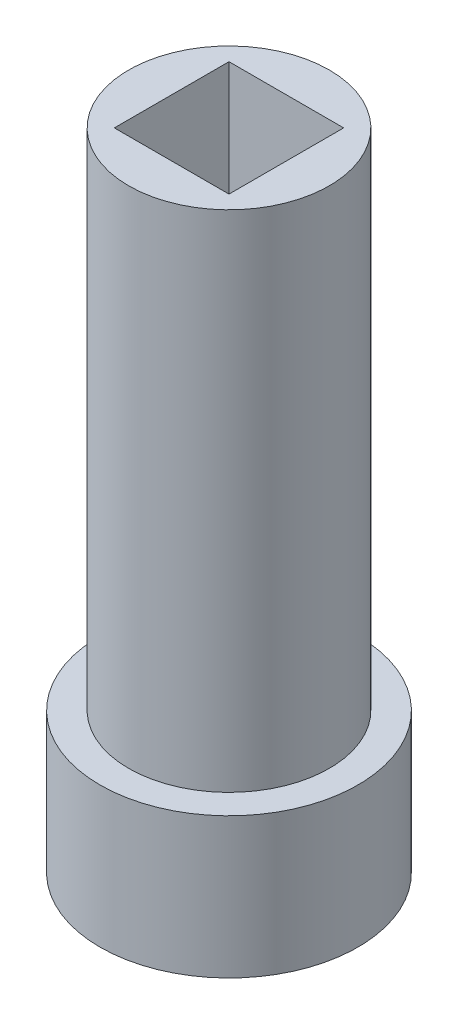
ISO-10303-21;
HEADER;
FILE_DESCRIPTION(('STEP AP214'),'2;1');
FILE_NAME('part.step','',(''),(''),'','','');
FILE_SCHEMA(('AUTOMOTIVE_DESIGN { 1 0 10303 214 1 1 1 1 }'));
ENDSEC;
DATA;
#1=APPLICATION_CONTEXT('core data for automotive mechanical design processes');
#2=APPLICATION_PROTOCOL_DEFINITION('international standard','automotive_design',2000,#1);
#3=PRODUCT_CONTEXT('',#1,'mechanical');
#4=PRODUCT('Part','Part','',(#3));
#5=PRODUCT_RELATED_PRODUCT_CATEGORY('part','',(#4));
#6=PRODUCT_DEFINITION_FORMATION('','',#4);
#7=PRODUCT_DEFINITION_CONTEXT('part definition',#1,'design');
#8=PRODUCT_DEFINITION('design','',#6,#7);
#9=PRODUCT_DEFINITION_SHAPE('','',#8);
#10=(LENGTH_UNIT() NAMED_UNIT(*) SI_UNIT(.MILLI.,.METRE.));
#11=(NAMED_UNIT(*) PLANE_ANGLE_UNIT() SI_UNIT($,.RADIAN.));
#12=(NAMED_UNIT(*) SI_UNIT($,.STERADIAN.) SOLID_ANGLE_UNIT());
#13=UNCERTAINTY_MEASURE_WITH_UNIT(LENGTH_MEASURE(1.E-05),#10,'distance_accuracy_value','');
#14=(GEOMETRIC_REPRESENTATION_CONTEXT(3) GLOBAL_UNCERTAINTY_ASSIGNED_CONTEXT((#13)) GLOBAL_UNIT_ASSIGNED_CONTEXT((#10,
#11,#12)) REPRESENTATION_CONTEXT('',''));
#15=CARTESIAN_POINT('',(0.,0.,0.));
#16=DIRECTION('',(0.,0.,1.));
#17=DIRECTION('',(1.,0.,0.));
#18=AXIS2_PLACEMENT_3D('',#15,#16,#17);
#19=CARTESIAN_POINT('',(0.,45.,0.));
#20=DIRECTION('',(0.,-1.,0.));
#21=DIRECTION('',(0.,0.,-1.));
#22=AXIS2_PLACEMENT_3D('',#19,#20,#21);
#23=CYLINDRICAL_SURFACE('',#22,7.);
#24=CARTESIAN_POINT('',(0.,45.,0.));
#25=DIRECTION('',(0.,1.,0.));
#26=DIRECTION('',(0.,0.,1.));
#27=AXIS2_PLACEMENT_3D('',#24,#25,#26);
#28=CIRCLE('',#27,7.);
#29=CARTESIAN_POINT('',(0.,45.,-7.));
#30=VERTEX_POINT('',#29);
#31=EDGE_CURVE('E44',#30,#30,#28,.T.);
#32=CARTESIAN_POINT('',(0.,9.8,0.));
#33=DIRECTION('',(0.,-1.,0.));
#34=DIRECTION('',(0.,0.,-1.));
#35=AXIS2_PLACEMENT_3D('',#32,#33,#34);
#36=CIRCLE('',#35,7.);
#37=CARTESIAN_POINT('',(0.,9.80000000000001,-7.));
#38=VERTEX_POINT('',#37);
#39=EDGE_CURVE('E11',#38,#38,#36,.T.);
#40=CARTESIAN_POINT('',(0.,45.,-7.));
#41=CARTESIAN_POINT('',(0.,44.6333333333333,-7.));
#42=CARTESIAN_POINT('',(0.,44.2666666666667,-7.));
#43=CARTESIAN_POINT('',(0.,43.5333333333333,-7.));
#44=CARTESIAN_POINT('',(0.,43.1666666666667,-7.));
#45=CARTESIAN_POINT('',(0.,42.4333333333333,-7.));
#46=CARTESIAN_POINT('',(0.,42.0666666666667,-7.));
#47=CARTESIAN_POINT('',(0.,41.3333333333333,-7.));
#48=CARTESIAN_POINT('',(0.,40.9666666666667,-7.));
#49=CARTESIAN_POINT('',(0.,40.2333333333333,-7.));
#50=CARTESIAN_POINT('',(0.,39.8666666666667,-7.));
#51=CARTESIAN_POINT('',(0.,39.1333333333333,-7.));
#52=CARTESIAN_POINT('',(0.,38.7666666666667,-7.));
#53=CARTESIAN_POINT('',(0.,38.0333333333333,-7.));
#54=CARTESIAN_POINT('',(0.,37.6666666666667,-7.));
#55=CARTESIAN_POINT('',(0.,36.9333333333333,-7.));
#56=CARTESIAN_POINT('',(0.,36.5666666666667,-7.));
#57=CARTESIAN_POINT('',(0.,35.8333333333333,-7.));
#58=CARTESIAN_POINT('',(0.,35.4666666666667,-7.));
#59=CARTESIAN_POINT('',(0.,34.7333333333333,-7.));
#60=CARTESIAN_POINT('',(0.,34.3666666666667,-7.));
#61=CARTESIAN_POINT('',(0.,33.6333333333333,-7.));
#62=CARTESIAN_POINT('',(0.,33.2666666666667,-7.));
#63=CARTESIAN_POINT('',(0.,32.5333333333333,-7.));
#64=CARTESIAN_POINT('',(0.,32.1666666666667,-7.));
#65=CARTESIAN_POINT('',(0.,31.4333333333333,-7.));
#66=CARTESIAN_POINT('',(0.,31.0666666666667,-7.));
#67=CARTESIAN_POINT('',(0.,30.3333333333333,-7.));
#68=CARTESIAN_POINT('',(0.,29.9666666666667,-7.));
#69=CARTESIAN_POINT('',(0.,29.2333333333333,-7.));
#70=CARTESIAN_POINT('',(0.,28.8666666666667,-7.));
#71=CARTESIAN_POINT('',(0.,28.1333333333333,-7.));
#72=CARTESIAN_POINT('',(0.,27.7666666666667,-7.));
#73=CARTESIAN_POINT('',(0.,27.0333333333333,-7.));
#74=CARTESIAN_POINT('',(0.,26.6666666666667,-7.));
#75=CARTESIAN_POINT('',(0.,25.9333333333333,-7.));
#76=CARTESIAN_POINT('',(0.,25.5666666666667,-7.));
#77=CARTESIAN_POINT('',(0.,24.8333333333333,-7.));
#78=CARTESIAN_POINT('',(0.,24.4666666666667,-7.));
#79=CARTESIAN_POINT('',(0.,23.7333333333333,-7.));
#80=CARTESIAN_POINT('',(0.,23.3666666666667,-7.));
#81=CARTESIAN_POINT('',(0.,22.6333333333333,-7.));
#82=CARTESIAN_POINT('',(0.,22.2666666666667,-7.));
#83=CARTESIAN_POINT('',(0.,21.5333333333333,-7.));
#84=CARTESIAN_POINT('',(0.,21.1666666666667,-7.));
#85=CARTESIAN_POINT('',(0.,20.4333333333333,-7.));
#86=CARTESIAN_POINT('',(0.,20.0666666666667,-7.));
#87=CARTESIAN_POINT('',(0.,19.3333333333333,-7.));
#88=CARTESIAN_POINT('',(0.,18.9666666666667,-7.));
#89=CARTESIAN_POINT('',(0.,18.2333333333333,-7.));
#90=CARTESIAN_POINT('',(0.,17.8666666666667,-7.));
#91=CARTESIAN_POINT('',(0.,17.1333333333333,-7.));
#92=CARTESIAN_POINT('',(0.,16.7666666666667,-7.));
#93=CARTESIAN_POINT('',(0.,16.0333333333333,-7.));
#94=CARTESIAN_POINT('',(0.,15.6666666666667,-7.));
#95=CARTESIAN_POINT('',(0.,14.9333333333333,-7.));
#96=CARTESIAN_POINT('',(0.,14.5666666666667,-7.));
#97=CARTESIAN_POINT('',(0.,13.8333333333333,-7.));
#98=CARTESIAN_POINT('',(0.,13.4666666666667,-7.));
#99=CARTESIAN_POINT('',(0.,12.7333333333333,-7.));
#100=CARTESIAN_POINT('',(0.,12.3666666666667,-7.));
#101=CARTESIAN_POINT('',(0.,11.6333333333333,-7.));
#102=CARTESIAN_POINT('',(0.,11.2666666666667,-7.));
#103=CARTESIAN_POINT('',(0.,10.5333333333333,-7.));
#104=CARTESIAN_POINT('',(0.,10.1666666666667,-7.));
#105=CARTESIAN_POINT('',(0.,9.80000000000001,-7.));
#106=B_SPLINE_CURVE_WITH_KNOTS('',3,(#40,#41,#42,#43,#44,#45,#46,#47,#48,#49,#50,#51,#52,#53,
#54,#55,#56,#57,#58,#59,#60,#61,#62,#63,#64,#65,#66,#67,#68,#69,#70,#71,#72,#73,#74,#75,#76,#77,
#78,#79,#80,#81,#82,#83,#84,#85,#86,#87,#88,#89,#90,#91,#92,#93,#94,#95,#96,#97,#98,#99,#100,
#101,#102,#103,#104,#105),.UNSPECIFIED.,.F.,.F.,(4,2,2,2,2,2,2,2,2,2,2,2,2,2,2,2,2,2,2,2,2,2,2,
2,2,2,2,2,2,2,2,2,4),(0.,1.1,2.2,3.3,4.4,5.50000000000001,6.6,7.7,8.8,9.9,11.,12.1,13.2,14.3,
15.4,16.5,17.6,18.7,19.8,20.9,22.,23.1,24.2,25.3,26.4,27.5,28.6,29.7,30.8,31.9,33.,34.1,35.2),.UNSPECIFIED.);
#107=EDGE_CURVE('BSEAM37',#30,#38,#106,.T.);
#108=ORIENTED_EDGE('',*,*,#31,.F.);
#109=ORIENTED_EDGE('',*,*,#39,.F.);
#110=ORIENTED_EDGE('',*,*,#107,.T.);
#111=ORIENTED_EDGE('',*,*,#107,.F.);
#112=EDGE_LOOP('',(#108,#110,#109,#111));
#113=FACE_BOUND('',#112,.T.);
#114=ADVANCED_FACE('F37',(#113),#23,.T.);
#115=CARTESIAN_POINT('',(0.,45.,0.));
#116=DIRECTION('',(0.,1.,0.));
#117=DIRECTION('',(0.,0.,1.));
#118=AXIS2_PLACEMENT_3D('',#115,#116,#117);
#119=PLANE('',#118);
#120=DIRECTION('',(0.,0.,1.));
#121=VECTOR('',#120,1.);
#122=CARTESIAN_POINT('',(-4.,45.,-4.));
#123=LINE('',#122,#121);
#124=CARTESIAN_POINT('',(-4.,45.,-4.));
#125=VERTEX_POINT('',#124);
#126=CARTESIAN_POINT('',(-4.,45.,4.));
#127=VERTEX_POINT('',#126);
#128=EDGE_CURVE('E51',#125,#127,#123,.T.);
#129=ORIENTED_EDGE('',*,*,#128,.F.);
#130=DIRECTION('',(-1.,0.,0.));
#131=VECTOR('',#130,1.);
#132=CARTESIAN_POINT('',(-4.,45.,-4.));
#133=LINE('',#132,#131);
#134=CARTESIAN_POINT('',(4.,45.,-4.));
#135=VERTEX_POINT('',#134);
#136=EDGE_CURVE('E102',#135,#125,#133,.T.);
#137=ORIENTED_EDGE('',*,*,#136,.F.);
#138=DIRECTION('',(0.,0.,-1.));
#139=VECTOR('',#138,1.);
#140=CARTESIAN_POINT('',(4.,45.,-4.));
#141=LINE('',#140,#139);
#142=CARTESIAN_POINT('',(4.,45.,4.));
#143=VERTEX_POINT('',#142);
#144=EDGE_CURVE('E110',#143,#135,#141,.T.);
#145=ORIENTED_EDGE('',*,*,#144,.F.);
#146=DIRECTION('',(1.,0.,0.));
#147=VECTOR('',#146,1.);
#148=CARTESIAN_POINT('',(-4.,45.,4.));
#149=LINE('',#148,#147);
#150=EDGE_CURVE('E86',#127,#143,#149,.T.);
#151=ORIENTED_EDGE('',*,*,#150,.F.);
#152=EDGE_LOOP('',(#129,#137,#145,#151));
#153=FACE_BOUND('',#152,.T.);
#154=ORIENTED_EDGE('',*,*,#31,.T.);
#155=EDGE_LOOP('',(#154));
#156=FACE_BOUND('',#155,.T.);
#157=ADVANCED_FACE('F118',(#153,#156),#119,.T.);
#158=CARTESIAN_POINT('',(-4.,23.,-4.));
#159=DIRECTION('',(-1.,0.,0.));
#160=DIRECTION('',(0.,0.,1.));
#161=AXIS2_PLACEMENT_3D('',#158,#159,#160);
#162=PLANE('',#161);
#163=ORIENTED_EDGE('',*,*,#128,.T.);
#164=DIRECTION('',(0.,1.,0.));
#165=VECTOR('',#164,1.);
#166=CARTESIAN_POINT('',(-4.,23.,4.));
#167=LINE('',#166,#165);
#168=CARTESIAN_POINT('',(-4.,23.,4.));
#169=VERTEX_POINT('',#168);
#170=EDGE_CURVE('E74',#169,#127,#167,.T.);
#171=ORIENTED_EDGE('',*,*,#170,.F.);
#172=DIRECTION('',(0.,0.,1.));
#173=VECTOR('',#172,1.);
#174=CARTESIAN_POINT('',(-4.,23.,-4.));
#175=LINE('',#174,#173);
#176=CARTESIAN_POINT('',(-4.,23.,-4.));
#177=VERTEX_POINT('',#176);
#178=EDGE_CURVE('E100',#177,#169,#175,.T.);
#179=ORIENTED_EDGE('',*,*,#178,.F.);
#180=DIRECTION('',(0.,1.,0.));
#181=VECTOR('',#180,1.);
#182=CARTESIAN_POINT('',(-4.,23.,-4.));
#183=LINE('',#182,#181);
#184=EDGE_CURVE('E59',#177,#125,#183,.T.);
#185=ORIENTED_EDGE('',*,*,#184,.T.);
#186=EDGE_LOOP('',(#163,#171,#179,#185));
#187=FACE_BOUND('',#186,.T.);
#188=ADVANCED_FACE('F149',(#187),#162,.F.);
#189=CARTESIAN_POINT('',(-4.,23.,-4.));
#190=DIRECTION('',(0.,0.,-1.));
#191=DIRECTION('',(-1.,0.,0.));
#192=AXIS2_PLACEMENT_3D('',#189,#190,#191);
#193=PLANE('',#192);
#194=ORIENTED_EDGE('',*,*,#136,.T.);
#195=ORIENTED_EDGE('',*,*,#184,.F.);
#196=DIRECTION('',(-1.,0.,0.));
#197=VECTOR('',#196,1.);
#198=CARTESIAN_POINT('',(-4.,23.,-4.));
#199=LINE('',#198,#197);
#200=CARTESIAN_POINT('',(4.,23.,-4.));
#201=VERTEX_POINT('',#200);
#202=EDGE_CURVE('E97',#201,#177,#199,.T.);
#203=ORIENTED_EDGE('',*,*,#202,.F.);
#204=DIRECTION('',(0.,1.,0.));
#205=VECTOR('',#204,1.);
#206=CARTESIAN_POINT('',(4.,23.,-4.));
#207=LINE('',#206,#205);
#208=EDGE_CURVE('E90',#201,#135,#207,.T.);
#209=ORIENTED_EDGE('',*,*,#208,.T.);
#210=EDGE_LOOP('',(#194,#195,#203,#209));
#211=FACE_BOUND('',#210,.T.);
#212=ADVANCED_FACE('F146',(#211),#193,.F.);
#213=CARTESIAN_POINT('',(4.,23.,-4.));
#214=DIRECTION('',(1.,0.,0.));
#215=DIRECTION('',(0.,0.,-1.));
#216=AXIS2_PLACEMENT_3D('',#213,#214,#215);
#217=PLANE('',#216);
#218=ORIENTED_EDGE('',*,*,#144,.T.);
#219=ORIENTED_EDGE('',*,*,#208,.F.);
#220=DIRECTION('',(0.,0.,-1.));
#221=VECTOR('',#220,1.);
#222=CARTESIAN_POINT('',(4.,23.,-4.));
#223=LINE('',#222,#221);
#224=CARTESIAN_POINT('',(4.,23.,4.));
#225=VERTEX_POINT('',#224);
#226=EDGE_CURVE('E93',#225,#201,#223,.T.);
#227=ORIENTED_EDGE('',*,*,#226,.F.);
#228=DIRECTION('',(0.,1.,0.));
#229=VECTOR('',#228,1.);
#230=CARTESIAN_POINT('',(4.,23.,4.));
#231=LINE('',#230,#229);
#232=EDGE_CURVE('E79',#225,#143,#231,.T.);
#233=ORIENTED_EDGE('',*,*,#232,.T.);
#234=EDGE_LOOP('',(#218,#219,#227,#233));
#235=FACE_BOUND('',#234,.T.);
#236=ADVANCED_FACE('F94',(#235),#217,.F.);
#237=CARTESIAN_POINT('',(-4.,23.,4.));
#238=DIRECTION('',(0.,0.,1.));
#239=DIRECTION('',(1.,0.,0.));
#240=AXIS2_PLACEMENT_3D('',#237,#238,#239);
#241=PLANE('',#240);
#242=ORIENTED_EDGE('',*,*,#150,.T.);
#243=ORIENTED_EDGE('',*,*,#232,.F.);
#244=DIRECTION('',(1.,0.,0.));
#245=VECTOR('',#244,1.);
#246=CARTESIAN_POINT('',(-4.,23.,4.));
#247=LINE('',#246,#245);
#248=EDGE_CURVE('E83',#169,#225,#247,.T.);
#249=ORIENTED_EDGE('',*,*,#248,.F.);
#250=ORIENTED_EDGE('',*,*,#170,.T.);
#251=EDGE_LOOP('',(#242,#243,#249,#250));
#252=FACE_BOUND('',#251,.T.);
#253=ADVANCED_FACE('F81',(#252),#241,.F.);
#254=CARTESIAN_POINT('',(0.,23.,0.));
#255=DIRECTION('',(0.,1.,0.));
#256=DIRECTION('',(0.,0.,1.));
#257=AXIS2_PLACEMENT_3D('',#254,#255,#256);
#258=PLANE('',#257);
#259=ORIENTED_EDGE('',*,*,#178,.T.);
#260=ORIENTED_EDGE('',*,*,#248,.T.);
#261=ORIENTED_EDGE('',*,*,#226,.T.);
#262=ORIENTED_EDGE('',*,*,#202,.T.);
#263=EDGE_LOOP('',(#259,#260,#261,#262));
#264=FACE_BOUND('',#263,.T.);
#265=ADVANCED_FACE('F99',(#264),#258,.T.);
#266=CARTESIAN_POINT('',(0.,9.8,0.));
#267=DIRECTION('',(0.,-1.,0.));
#268=DIRECTION('',(0.,0.,-1.));
#269=AXIS2_PLACEMENT_3D('',#266,#267,#268);
#270=CYLINDRICAL_SURFACE('',#269,9.);
#271=CARTESIAN_POINT('',(0.,9.8,0.));
#272=DIRECTION('',(0.,-1.,0.));
#273=DIRECTION('',(0.,0.,-1.));
#274=AXIS2_PLACEMENT_3D('',#271,#272,#273);
#275=CIRCLE('',#274,9.);
#276=CARTESIAN_POINT('',(0.,9.8,-9.));
#277=VERTEX_POINT('',#276);
#278=EDGE_CURVE('E108',#277,#277,#275,.T.);
#279=ORIENTED_EDGE('',*,*,#278,.T.);
#280=EDGE_LOOP('',(#279));
#281=FACE_BOUND('',#280,.T.);
#282=CARTESIAN_POINT('',(0.,0.,0.));
#283=DIRECTION('',(0.,-1.,0.));
#284=DIRECTION('',(0.,0.,-1.));
#285=AXIS2_PLACEMENT_3D('',#282,#283,#284);
#286=CIRCLE('',#285,9.);
#287=CARTESIAN_POINT('',(0.,0.,-9.));
#288=VERTEX_POINT('',#287);
#289=EDGE_CURVE('E133',#288,#288,#286,.T.);
#290=ORIENTED_EDGE('',*,*,#289,.F.);
#291=EDGE_LOOP('',(#290));
#292=FACE_BOUND('',#291,.T.);
#293=ADVANCED_FACE('F128',(#281,#292),#270,.T.);
#294=CARTESIAN_POINT('',(0.,9.8,0.));
#295=DIRECTION('',(0.,-1.,0.));
#296=DIRECTION('',(0.,0.,-1.));
#297=AXIS2_PLACEMENT_3D('',#294,#295,#296);
#298=PLANE('',#297);
#299=ORIENTED_EDGE('',*,*,#39,.T.);
#300=EDGE_LOOP('',(#299));
#301=FACE_BOUND('',#300,.T.);
#302=ORIENTED_EDGE('',*,*,#278,.F.);
#303=EDGE_LOOP('',(#302));
#304=FACE_BOUND('',#303,.T.);
#305=ADVANCED_FACE('F124',(#301,#304),#298,.F.);
#306=CARTESIAN_POINT('',(0.,0.,0.));
#307=DIRECTION('',(0.,1.,0.));
#308=DIRECTION('',(0.,0.,1.));
#309=AXIS2_PLACEMENT_3D('',#306,#307,#308);
#310=PLANE('',#309);
#311=ORIENTED_EDGE('',*,*,#289,.T.);
#312=EDGE_LOOP('',(#311));
#313=FACE_BOUND('',#312,.T.);
#314=ADVANCED_FACE('F127',(#313),#310,.F.);
#315=CLOSED_SHELL('',(#114,#157,#188,#212,#236,#253,#265,#293,#305,#314));
#316=MANIFOLD_SOLID_BREP('B2',#315);
#317=ADVANCED_BREP_SHAPE_REPRESENTATION('',(#18,#316),#14);
#318=SHAPE_DEFINITION_REPRESENTATION(#9,#317);
ENDSEC;
END-ISO-10303-21;
